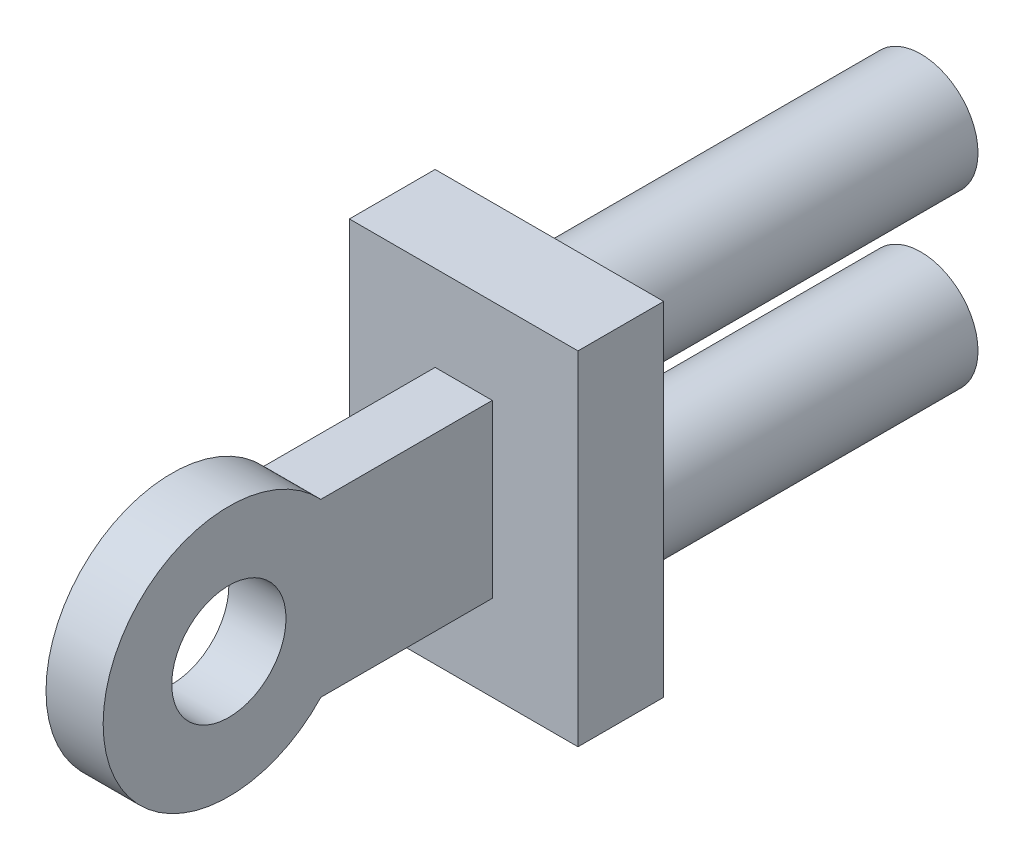
ISO-10303-21;
HEADER;
FILE_DESCRIPTION(('STEP AP214'),'2;1');
FILE_NAME('part.step','',(''),(''),'','','');
FILE_SCHEMA(('AUTOMOTIVE_DESIGN { 1 0 10303 214 1 1 1 1 }'));
ENDSEC;
DATA;
#1=APPLICATION_CONTEXT('core data for automotive mechanical design processes');
#2=APPLICATION_PROTOCOL_DEFINITION('international standard','automotive_design',2000,#1);
#3=PRODUCT_CONTEXT('',#1,'mechanical');
#4=PRODUCT('Part','Part','',(#3));
#5=PRODUCT_RELATED_PRODUCT_CATEGORY('part','',(#4));
#6=PRODUCT_DEFINITION_FORMATION('','',#4);
#7=PRODUCT_DEFINITION_CONTEXT('part definition',#1,'design');
#8=PRODUCT_DEFINITION('design','',#6,#7);
#9=PRODUCT_DEFINITION_SHAPE('','',#8);
#10=(LENGTH_UNIT() NAMED_UNIT(*) SI_UNIT(.MILLI.,.METRE.));
#11=(NAMED_UNIT(*) PLANE_ANGLE_UNIT() SI_UNIT($,.RADIAN.));
#12=(NAMED_UNIT(*) SI_UNIT($,.STERADIAN.) SOLID_ANGLE_UNIT());
#13=UNCERTAINTY_MEASURE_WITH_UNIT(LENGTH_MEASURE(1.E-05),#10,'distance_accuracy_value','');
#14=(GEOMETRIC_REPRESENTATION_CONTEXT(3) GLOBAL_UNCERTAINTY_ASSIGNED_CONTEXT((#13)) GLOBAL_UNIT_ASSIGNED_CONTEXT((#10,
#11,#12)) REPRESENTATION_CONTEXT('',''));
#15=CARTESIAN_POINT('',(0.,0.,0.));
#16=DIRECTION('',(0.,0.,1.));
#17=DIRECTION('',(1.,0.,0.));
#18=AXIS2_PLACEMENT_3D('',#15,#16,#17);
#19=CARTESIAN_POINT('',(-2.,3.,1.5));
#20=DIRECTION('',(1.,0.,0.));
#21=DIRECTION('',(0.,1.,0.));
#22=AXIS2_PLACEMENT_3D('',#19,#20,#21);
#23=PLANE('',#22);
#24=DIRECTION('',(0.,-1.,0.));
#25=VECTOR('',#24,1.);
#26=CARTESIAN_POINT('',(-2.,3.,0.));
#27=LINE('',#26,#25);
#28=CARTESIAN_POINT('',(-2.,3.,0.));
#29=VERTEX_POINT('',#28);
#30=CARTESIAN_POINT('',(-2.,-3.,0.));
#31=VERTEX_POINT('',#30);
#32=EDGE_CURVE('E136',#29,#31,#27,.T.);
#33=ORIENTED_EDGE('',*,*,#32,.T.);
#34=DIRECTION('',(0.,0.,-1.));
#35=VECTOR('',#34,1.);
#36=CARTESIAN_POINT('',(-2.,-3.,1.5));
#37=LINE('',#36,#35);
#38=CARTESIAN_POINT('',(-2.,-3.,1.5));
#39=VERTEX_POINT('',#38);
#40=EDGE_CURVE('E11',#39,#31,#37,.T.);
#41=ORIENTED_EDGE('',*,*,#40,.F.);
#42=DIRECTION('',(0.,-1.,0.));
#43=VECTOR('',#42,1.);
#44=CARTESIAN_POINT('',(-2.,3.,1.5));
#45=LINE('',#44,#43);
#46=CARTESIAN_POINT('',(-2.,3.,1.5));
#47=VERTEX_POINT('',#46);
#48=EDGE_CURVE('E137',#47,#39,#45,.T.);
#49=ORIENTED_EDGE('',*,*,#48,.F.);
#50=DIRECTION('',(0.,0.,-1.));
#51=VECTOR('',#50,1.);
#52=CARTESIAN_POINT('',(-2.,3.,1.5));
#53=LINE('',#52,#51);
#54=EDGE_CURVE('E147',#47,#29,#53,.T.);
#55=ORIENTED_EDGE('',*,*,#54,.T.);
#56=EDGE_LOOP('',(#33,#41,#49,#55));
#57=FACE_BOUND('',#56,.T.);
#58=ADVANCED_FACE('F32',(#57),#23,.F.);
#59=CARTESIAN_POINT('',(2.,-3.,1.5));
#60=DIRECTION('',(0.,1.,0.));
#61=DIRECTION('',(-1.,0.,0.));
#62=AXIS2_PLACEMENT_3D('',#59,#60,#61);
#63=PLANE('',#62);
#64=DIRECTION('',(1.,0.,0.));
#65=VECTOR('',#64,1.);
#66=CARTESIAN_POINT('',(2.,-3.,0.));
#67=LINE('',#66,#65);
#68=CARTESIAN_POINT('',(2.,-3.,0.));
#69=VERTEX_POINT('',#68);
#70=EDGE_CURVE('E150',#31,#69,#67,.T.);
#71=ORIENTED_EDGE('',*,*,#70,.T.);
#72=DIRECTION('',(0.,0.,-1.));
#73=VECTOR('',#72,1.);
#74=CARTESIAN_POINT('',(2.,-3.,1.5));
#75=LINE('',#74,#73);
#76=CARTESIAN_POINT('',(2.,-3.,1.5));
#77=VERTEX_POINT('',#76);
#78=EDGE_CURVE('E39',#77,#69,#75,.T.);
#79=ORIENTED_EDGE('',*,*,#78,.F.);
#80=DIRECTION('',(1.,0.,0.));
#81=VECTOR('',#80,1.);
#82=CARTESIAN_POINT('',(2.,-3.,1.5));
#83=LINE('',#82,#81);
#84=EDGE_CURVE('E140',#39,#77,#83,.T.);
#85=ORIENTED_EDGE('',*,*,#84,.F.);
#86=ORIENTED_EDGE('',*,*,#40,.T.);
#87=EDGE_LOOP('',(#71,#79,#85,#86));
#88=FACE_BOUND('',#87,.T.);
#89=ADVANCED_FACE('F180',(#88),#63,.F.);
#90=CARTESIAN_POINT('',(2.,3.,1.5));
#91=DIRECTION('',(-1.,0.,0.));
#92=DIRECTION('',(0.,-1.,0.));
#93=AXIS2_PLACEMENT_3D('',#90,#91,#92);
#94=PLANE('',#93);
#95=DIRECTION('',(0.,1.,0.));
#96=VECTOR('',#95,1.);
#97=CARTESIAN_POINT('',(2.,3.,0.));
#98=LINE('',#97,#96);
#99=CARTESIAN_POINT('',(2.,3.,0.));
#100=VERTEX_POINT('',#99);
#101=EDGE_CURVE('E152',#69,#100,#98,.T.);
#102=ORIENTED_EDGE('',*,*,#101,.T.);
#103=DIRECTION('',(0.,0.,-1.));
#104=VECTOR('',#103,1.);
#105=CARTESIAN_POINT('',(2.,3.,1.5));
#106=LINE('',#105,#104);
#107=CARTESIAN_POINT('',(2.,3.,1.5));
#108=VERTEX_POINT('',#107);
#109=EDGE_CURVE('E157',#108,#100,#106,.T.);
#110=ORIENTED_EDGE('',*,*,#109,.F.);
#111=DIRECTION('',(0.,1.,0.));
#112=VECTOR('',#111,1.);
#113=CARTESIAN_POINT('',(2.,3.,1.5));
#114=LINE('',#113,#112);
#115=EDGE_CURVE('E143',#77,#108,#114,.T.);
#116=ORIENTED_EDGE('',*,*,#115,.F.);
#117=ORIENTED_EDGE('',*,*,#78,.T.);
#118=EDGE_LOOP('',(#102,#110,#116,#117));
#119=FACE_BOUND('',#118,.T.);
#120=ADVANCED_FACE('F164',(#119),#94,.F.);
#121=CARTESIAN_POINT('',(2.,3.,1.5));
#122=DIRECTION('',(0.,-1.,0.));
#123=DIRECTION('',(1.,0.,0.));
#124=AXIS2_PLACEMENT_3D('',#121,#122,#123);
#125=PLANE('',#124);
#126=DIRECTION('',(-1.,0.,0.));
#127=VECTOR('',#126,1.);
#128=CARTESIAN_POINT('',(2.,3.,0.));
#129=LINE('',#128,#127);
#130=EDGE_CURVE('E141',#100,#29,#129,.T.);
#131=ORIENTED_EDGE('',*,*,#130,.T.);
#132=ORIENTED_EDGE('',*,*,#54,.F.);
#133=DIRECTION('',(-1.,0.,0.));
#134=VECTOR('',#133,1.);
#135=CARTESIAN_POINT('',(2.,3.,1.5));
#136=LINE('',#135,#134);
#137=EDGE_CURVE('E145',#108,#47,#136,.T.);
#138=ORIENTED_EDGE('',*,*,#137,.F.);
#139=ORIENTED_EDGE('',*,*,#109,.T.);
#140=EDGE_LOOP('',(#131,#132,#138,#139));
#141=FACE_BOUND('',#140,.T.);
#142=ADVANCED_FACE('F173',(#141),#125,.F.);
#143=CARTESIAN_POINT('',(0.,0.,1.5));
#144=DIRECTION('',(0.,0.,-1.));
#145=DIRECTION('',(-1.,0.,0.));
#146=AXIS2_PLACEMENT_3D('',#143,#144,#145);
#147=PLANE('',#146);
#148=DIRECTION('',(-1.,0.,0.));
#149=VECTOR('',#148,1.);
#150=CARTESIAN_POINT('',(0.5,1.49999999999442,1.50000000002137));
#151=LINE('',#150,#149);
#152=CARTESIAN_POINT('',(0.5,1.49999999999442,1.5));
#153=VERTEX_POINT('',#152);
#154=CARTESIAN_POINT('',(-0.5,1.49999999999442,1.5));
#155=VERTEX_POINT('',#154);
#156=EDGE_CURVE('E46',#153,#155,#151,.T.);
#157=ORIENTED_EDGE('',*,*,#156,.F.);
#158=DIRECTION('',(0.,1.,0.));
#159=VECTOR('',#158,1.);
#160=CARTESIAN_POINT('',(0.5,-291545.,1.50000000002137));
#161=LINE('',#160,#159);
#162=CARTESIAN_POINT('',(0.5,-1.49999999999442,1.5));
#163=VERTEX_POINT('',#162);
#164=EDGE_CURVE('E51',#163,#153,#161,.T.);
#165=ORIENTED_EDGE('',*,*,#164,.F.);
#166=DIRECTION('',(-1.,0.,0.));
#167=VECTOR('',#166,1.);
#168=CARTESIAN_POINT('',(0.5,-1.49999999999442,1.50000000002137));
#169=LINE('',#168,#167);
#170=CARTESIAN_POINT('',(-0.5,-1.49999999999442,1.50000000002137));
#171=VERTEX_POINT('',#170);
#172=EDGE_CURVE('E132',#163,#171,#169,.T.);
#173=ORIENTED_EDGE('',*,*,#172,.T.);
#174=DIRECTION('',(0.,1.,0.));
#175=VECTOR('',#174,1.);
#176=CARTESIAN_POINT('',(-0.5,-291545.,1.50000000002137));
#177=LINE('',#176,#175);
#178=EDGE_CURVE('E116',#171,#155,#177,.T.);
#179=ORIENTED_EDGE('',*,*,#178,.T.);
#180=EDGE_LOOP('',(#157,#165,#173,#179));
#181=FACE_BOUND('',#180,.T.);
#182=ORIENTED_EDGE('',*,*,#48,.T.);
#183=ORIENTED_EDGE('',*,*,#84,.T.);
#184=ORIENTED_EDGE('',*,*,#115,.T.);
#185=ORIENTED_EDGE('',*,*,#137,.T.);
#186=EDGE_LOOP('',(#182,#183,#184,#185));
#187=FACE_BOUND('',#186,.T.);
#188=ADVANCED_FACE('F179',(#181,#187),#147,.F.);
#189=CARTESIAN_POINT('',(0.,0.,0.));
#190=DIRECTION('',(0.,0.,-1.));
#191=DIRECTION('',(-1.,0.,0.));
#192=AXIS2_PLACEMENT_3D('',#189,#190,#191);
#193=PLANE('',#192);
#194=CARTESIAN_POINT('',(0.,-1.5,0.));
#195=DIRECTION('',(0.,0.,-1.));
#196=DIRECTION('',(-1.,0.,0.));
#197=AXIS2_PLACEMENT_3D('',#194,#195,#196);
#198=CIRCLE('',#197,1.);
#199=CARTESIAN_POINT('',(1.,-1.5,0.));
#200=VERTEX_POINT('',#199);
#201=EDGE_CURVE('E235',#200,#200,#198,.T.);
#202=ORIENTED_EDGE('',*,*,#201,.F.);
#203=EDGE_LOOP('',(#202));
#204=FACE_BOUND('',#203,.T.);
#205=CARTESIAN_POINT('',(0.,1.5,0.));
#206=DIRECTION('',(0.,0.,-1.));
#207=DIRECTION('',(-1.,0.,0.));
#208=AXIS2_PLACEMENT_3D('',#205,#206,#207);
#209=CIRCLE('',#208,1.);
#210=CARTESIAN_POINT('',(1.,1.5,0.));
#211=VERTEX_POINT('',#210);
#212=EDGE_CURVE('E234',#211,#211,#209,.T.);
#213=ORIENTED_EDGE('',*,*,#212,.F.);
#214=EDGE_LOOP('',(#213));
#215=FACE_BOUND('',#214,.T.);
#216=ORIENTED_EDGE('',*,*,#32,.F.);
#217=ORIENTED_EDGE('',*,*,#130,.F.);
#218=ORIENTED_EDGE('',*,*,#101,.F.);
#219=ORIENTED_EDGE('',*,*,#70,.F.);
#220=EDGE_LOOP('',(#216,#217,#218,#219));
#221=FACE_BOUND('',#220,.T.);
#222=ADVANCED_FACE('F170',(#204,#215,#221),#193,.T.);
#223=CARTESIAN_POINT('',(0.5,0.,6.10934769394311));
#224=DIRECTION('',(1.,0.,0.));
#225=DIRECTION('',(0.,0.,-1.));
#226=AXIS2_PLACEMENT_3D('',#223,#224,#225);
#227=PLANE('',#226);
#228=ORIENTED_EDGE('',*,*,#164,.T.);
#229=DIRECTION('',(0.,0.,1.));
#230=VECTOR('',#229,1.);
#231=CARTESIAN_POINT('',(0.5,1.49999999990769,400004.154673847));
#232=LINE('',#231,#230);
#233=CARTESIAN_POINT('',(0.5,1.50000000000064,4.5000000000006));
#234=VERTEX_POINT('',#233);
#235=EDGE_CURVE('E127',#153,#234,#232,.T.);
#236=ORIENTED_EDGE('',*,*,#235,.T.);
#237=CARTESIAN_POINT('',(0.5,0.,6.10934769394311));
#238=DIRECTION('',(1.,0.,0.));
#239=DIRECTION('',(0.,0.,-1.));
#240=AXIS2_PLACEMENT_3D('',#237,#238,#239);
#241=CIRCLE('',#240,2.2);
#242=CARTESIAN_POINT('',(0.5,-1.49999999999442,4.50000000000728));
#243=VERTEX_POINT('',#242);
#244=EDGE_CURVE('E102',#234,#243,#241,.T.);
#245=ORIENTED_EDGE('',*,*,#244,.T.);
#246=DIRECTION('',(0.,0.,-1.));
#247=VECTOR('',#246,1.);
#248=CARTESIAN_POINT('',(0.5,-1.49999999990769,400004.154673847));
#249=LINE('',#248,#247);
#250=EDGE_CURVE('E130',#243,#163,#249,.T.);
#251=ORIENTED_EDGE('',*,*,#250,.T.);
#252=EDGE_LOOP('',(#228,#236,#245,#251));
#253=FACE_BOUND('',#252,.T.);
#254=CARTESIAN_POINT('',(0.5,0.,6.10934769394311));
#255=DIRECTION('',(1.,0.,0.));
#256=DIRECTION('',(0.,0.,-1.));
#257=AXIS2_PLACEMENT_3D('',#254,#255,#256);
#258=CIRCLE('',#257,1.);
#259=CARTESIAN_POINT('',(0.5,0.,5.10934769394311));
#260=VERTEX_POINT('',#259);
#261=EDGE_CURVE('E123',#260,#260,#258,.T.);
#262=ORIENTED_EDGE('',*,*,#261,.F.);
#263=EDGE_LOOP('',(#262));
#264=FACE_BOUND('',#263,.T.);
#265=ADVANCED_FACE('F192',(#253,#264),#227,.T.);
#266=CARTESIAN_POINT('',(0.5,1.49999999990769,400004.154673847));
#267=DIRECTION('',(0.,-1.,0.));
#268=DIRECTION('',(0.,0.,-1.));
#269=AXIS2_PLACEMENT_3D('',#266,#267,#268);
#270=PLANE('',#269);
#271=ORIENTED_EDGE('',*,*,#156,.T.);
#272=DIRECTION('',(0.,0.,1.));
#273=VECTOR('',#272,1.);
#274=CARTESIAN_POINT('',(-0.5,1.49999999990769,400004.154673847));
#275=LINE('',#274,#273);
#276=CARTESIAN_POINT('',(-0.5,1.50000000000064,4.5000000000006));
#277=VERTEX_POINT('',#276);
#278=EDGE_CURVE('E111',#155,#277,#275,.T.);
#279=ORIENTED_EDGE('',*,*,#278,.T.);
#280=DIRECTION('',(-1.,0.,0.));
#281=VECTOR('',#280,1.);
#282=CARTESIAN_POINT('',(0.5,1.50000000000064,4.5000000000006));
#283=LINE('',#282,#281);
#284=EDGE_CURVE('E96',#234,#277,#283,.T.);
#285=ORIENTED_EDGE('',*,*,#284,.F.);
#286=ORIENTED_EDGE('',*,*,#235,.F.);
#287=EDGE_LOOP('',(#271,#279,#285,#286));
#288=FACE_BOUND('',#287,.T.);
#289=ADVANCED_FACE('F115',(#288),#270,.F.);
#290=CARTESIAN_POINT('',(0.5,0.,6.10934769394311));
#291=DIRECTION('',(-1.,0.,0.));
#292=DIRECTION('',(0.,-1.,0.));
#293=AXIS2_PLACEMENT_3D('',#290,#291,#292);
#294=CYLINDRICAL_SURFACE('',#293,2.2);
#295=ORIENTED_EDGE('',*,*,#284,.T.);
#296=CARTESIAN_POINT('',(-0.5,0.,6.10934769394311));
#297=DIRECTION('',(1.,0.,0.));
#298=DIRECTION('',(0.,0.,-1.));
#299=AXIS2_PLACEMENT_3D('',#296,#297,#298);
#300=CIRCLE('',#299,2.2);
#301=CARTESIAN_POINT('',(-0.5,-1.49999999999442,4.50000000000728));
#302=VERTEX_POINT('',#301);
#303=EDGE_CURVE('E100',#277,#302,#300,.T.);
#304=ORIENTED_EDGE('',*,*,#303,.T.);
#305=DIRECTION('',(-1.,0.,0.));
#306=VECTOR('',#305,1.);
#307=CARTESIAN_POINT('',(0.5,-1.49999999999442,4.50000000000728));
#308=LINE('',#307,#306);
#309=EDGE_CURVE('E105',#243,#302,#308,.T.);
#310=ORIENTED_EDGE('',*,*,#309,.F.);
#311=ORIENTED_EDGE('',*,*,#244,.F.);
#312=EDGE_LOOP('',(#295,#304,#310,#311));
#313=FACE_BOUND('',#312,.T.);
#314=ADVANCED_FACE('F98',(#313),#294,.T.);
#315=CARTESIAN_POINT('',(0.5,-1.49999999990769,400004.154673847));
#316=DIRECTION('',(0.,1.,0.));
#317=DIRECTION('',(0.,0.,1.));
#318=AXIS2_PLACEMENT_3D('',#315,#316,#317);
#319=PLANE('',#318);
#320=ORIENTED_EDGE('',*,*,#309,.T.);
#321=DIRECTION('',(0.,0.,-1.));
#322=VECTOR('',#321,1.);
#323=CARTESIAN_POINT('',(-0.5,-1.49999999990769,400004.154673847));
#324=LINE('',#323,#322);
#325=EDGE_CURVE('E113',#302,#171,#324,.T.);
#326=ORIENTED_EDGE('',*,*,#325,.T.);
#327=ORIENTED_EDGE('',*,*,#172,.F.);
#328=ORIENTED_EDGE('',*,*,#250,.F.);
#329=EDGE_LOOP('',(#320,#326,#327,#328));
#330=FACE_BOUND('',#329,.T.);
#331=ADVANCED_FACE('F200',(#330),#319,.F.);
#332=CARTESIAN_POINT('',(0.5,0.,6.10934769394311));
#333=DIRECTION('',(-1.,0.,0.));
#334=DIRECTION('',(0.,-1.,0.));
#335=AXIS2_PLACEMENT_3D('',#332,#333,#334);
#336=CYLINDRICAL_SURFACE('',#335,1.);
#337=ORIENTED_EDGE('',*,*,#261,.T.);
#338=EDGE_LOOP('',(#337));
#339=FACE_BOUND('',#338,.T.);
#340=CARTESIAN_POINT('',(-0.5,0.,6.10934769394311));
#341=DIRECTION('',(1.,0.,0.));
#342=DIRECTION('',(0.,0.,-1.));
#343=AXIS2_PLACEMENT_3D('',#340,#341,#342);
#344=CIRCLE('',#343,1.);
#345=CARTESIAN_POINT('',(-0.5,0.,5.10934769394311));
#346=VERTEX_POINT('',#345);
#347=EDGE_CURVE('E118',#346,#346,#344,.T.);
#348=ORIENTED_EDGE('',*,*,#347,.F.);
#349=EDGE_LOOP('',(#348));
#350=FACE_BOUND('',#349,.T.);
#351=ADVANCED_FACE('F203',(#339,#350),#336,.F.);
#352=CARTESIAN_POINT('',(-0.5,0.,6.10934769394311));
#353=DIRECTION('',(1.,0.,0.));
#354=DIRECTION('',(0.,0.,-1.));
#355=AXIS2_PLACEMENT_3D('',#352,#353,#354);
#356=PLANE('',#355);
#357=ORIENTED_EDGE('',*,*,#347,.T.);
#358=EDGE_LOOP('',(#357));
#359=FACE_BOUND('',#358,.T.);
#360=ORIENTED_EDGE('',*,*,#178,.F.);
#361=ORIENTED_EDGE('',*,*,#325,.F.);
#362=ORIENTED_EDGE('',*,*,#303,.F.);
#363=ORIENTED_EDGE('',*,*,#278,.F.);
#364=EDGE_LOOP('',(#360,#361,#362,#363));
#365=FACE_BOUND('',#364,.T.);
#366=ADVANCED_FACE('F110',(#359,#365),#356,.F.);
#367=CARTESIAN_POINT('',(0.,1.5,-6.5));
#368=DIRECTION('',(0.,0.,1.));
#369=DIRECTION('',(1.,0.,0.));
#370=AXIS2_PLACEMENT_3D('',#367,#368,#369);
#371=CYLINDRICAL_SURFACE('',#370,1.);
#372=CARTESIAN_POINT('',(0.,1.5,-6.5));
#373=DIRECTION('',(0.,0.,-1.));
#374=DIRECTION('',(-1.,0.,0.));
#375=AXIS2_PLACEMENT_3D('',#372,#373,#374);
#376=CIRCLE('',#375,1.);
#377=CARTESIAN_POINT('',(1.,1.5,-6.5));
#378=VERTEX_POINT('',#377);
#379=EDGE_CURVE('E238',#378,#378,#376,.T.);
#380=CARTESIAN_POINT('',(1.,1.5,-6.5));
#381=CARTESIAN_POINT('',(1.,1.5,-6.43229166666667));
#382=CARTESIAN_POINT('',(1.,1.5,-6.36458333333333));
#383=CARTESIAN_POINT('',(1.,1.5,-6.22916666666667));
#384=CARTESIAN_POINT('',(1.,1.5,-6.16145833333333));
#385=CARTESIAN_POINT('',(1.,1.5,-6.02604166666667));
#386=CARTESIAN_POINT('',(1.,1.5,-5.95833333333333));
#387=CARTESIAN_POINT('',(1.,1.5,-5.82291666666667));
#388=CARTESIAN_POINT('',(1.,1.5,-5.75520833333333));
#389=CARTESIAN_POINT('',(1.,1.5,-5.61979166666667));
#390=CARTESIAN_POINT('',(1.,1.5,-5.55208333333333));
#391=CARTESIAN_POINT('',(1.,1.5,-5.41666666666667));
#392=CARTESIAN_POINT('',(1.,1.5,-5.34895833333333));
#393=CARTESIAN_POINT('',(1.,1.5,-5.21354166666667));
#394=CARTESIAN_POINT('',(1.,1.5,-5.14583333333333));
#395=CARTESIAN_POINT('',(1.,1.5,-5.01041666666667));
#396=CARTESIAN_POINT('',(1.,1.5,-4.94270833333333));
#397=CARTESIAN_POINT('',(1.,1.5,-4.80729166666667));
#398=CARTESIAN_POINT('',(1.,1.5,-4.73958333333333));
#399=CARTESIAN_POINT('',(1.,1.5,-4.60416666666667));
#400=CARTESIAN_POINT('',(1.,1.5,-4.53645833333333));
#401=CARTESIAN_POINT('',(1.,1.5,-4.40104166666667));
#402=CARTESIAN_POINT('',(1.,1.5,-4.33333333333333));
#403=CARTESIAN_POINT('',(1.,1.5,-4.19791666666667));
#404=CARTESIAN_POINT('',(1.,1.5,-4.13020833333333));
#405=CARTESIAN_POINT('',(1.,1.5,-3.99479166666667));
#406=CARTESIAN_POINT('',(1.,1.5,-3.92708333333333));
#407=CARTESIAN_POINT('',(1.,1.5,-3.79166666666667));
#408=CARTESIAN_POINT('',(1.,1.5,-3.72395833333333));
#409=CARTESIAN_POINT('',(1.,1.5,-3.58854166666667));
#410=CARTESIAN_POINT('',(1.,1.5,-3.52083333333333));
#411=CARTESIAN_POINT('',(1.,1.5,-3.38541666666667));
#412=CARTESIAN_POINT('',(1.,1.5,-3.31770833333333));
#413=CARTESIAN_POINT('',(1.,1.5,-3.18229166666667));
#414=CARTESIAN_POINT('',(1.,1.5,-3.11458333333333));
#415=CARTESIAN_POINT('',(1.,1.5,-2.97916666666667));
#416=CARTESIAN_POINT('',(1.,1.5,-2.91145833333333));
#417=CARTESIAN_POINT('',(1.,1.5,-2.77604166666667));
#418=CARTESIAN_POINT('',(1.,1.5,-2.70833333333333));
#419=CARTESIAN_POINT('',(1.,1.5,-2.57291666666667));
#420=CARTESIAN_POINT('',(1.,1.5,-2.50520833333333));
#421=CARTESIAN_POINT('',(1.,1.5,-2.36979166666667));
#422=CARTESIAN_POINT('',(1.,1.5,-2.30208333333333));
#423=CARTESIAN_POINT('',(1.,1.5,-2.16666666666667));
#424=CARTESIAN_POINT('',(1.,1.5,-2.09895833333333));
#425=CARTESIAN_POINT('',(1.,1.5,-1.96354166666667));
#426=CARTESIAN_POINT('',(1.,1.5,-1.89583333333333));
#427=CARTESIAN_POINT('',(1.,1.5,-1.76041666666667));
#428=CARTESIAN_POINT('',(1.,1.5,-1.69270833333333));
#429=CARTESIAN_POINT('',(1.,1.5,-1.55729166666667));
#430=CARTESIAN_POINT('',(1.,1.5,-1.48958333333333));
#431=CARTESIAN_POINT('',(1.,1.5,-1.35416666666667));
#432=CARTESIAN_POINT('',(1.,1.5,-1.28645833333333));
#433=CARTESIAN_POINT('',(1.,1.5,-1.15104166666667));
#434=CARTESIAN_POINT('',(1.,1.5,-1.08333333333333));
#435=CARTESIAN_POINT('',(1.,1.5,-0.947916666666667));
#436=CARTESIAN_POINT('',(1.,1.5,-0.880208333333333));
#437=CARTESIAN_POINT('',(1.,1.5,-0.744791666666667));
#438=CARTESIAN_POINT('',(1.,1.5,-0.677083333333333));
#439=CARTESIAN_POINT('',(1.,1.5,-0.541666666666667));
#440=CARTESIAN_POINT('',(1.,1.5,-0.473958333333333));
#441=CARTESIAN_POINT('',(1.,1.5,-0.338541666666667));
#442=CARTESIAN_POINT('',(1.,1.5,-0.270833333333334));
#443=CARTESIAN_POINT('',(1.,1.5,-0.135416666666667));
#444=CARTESIAN_POINT('',(1.,1.5,-0.0677083333333334));
#445=CARTESIAN_POINT('',(1.,1.5,0.));
#446=B_SPLINE_CURVE_WITH_KNOTS('',3,(#380,#381,#382,#383,#384,#385,#386,#387,#388,#389,#390,
#391,#392,#393,#394,#395,#396,#397,#398,#399,#400,#401,#402,#403,#404,#405,#406,#407,#408,#409,
#410,#411,#412,#413,#414,#415,#416,#417,#418,#419,#420,#421,#422,#423,#424,#425,#426,#427,#428,
#429,#430,#431,#432,#433,#434,#435,#436,#437,#438,#439,#440,#441,#442,#443,#444,#445),
.UNSPECIFIED.,.F.,.F.,(4,2,2,2,2,2,2,2,2,2,2,2,2,2,2,2,2,2,2,2,2,2,2,2,2,2,2,2,2,2,2,2,4),(0.,
0.203125,0.40625,0.609375000000001,0.812500000000001,1.015625,1.21875,1.421875,1.625,1.828125,
2.03125,2.234375,2.4375,2.640625,2.84375,3.046875,3.25,3.453125,3.65625,3.859375,4.0625,
4.265625,4.46875,4.671875,4.875,5.078125,5.28125,5.484375,5.6875,5.890625,6.09375,6.296875,6.5),.UNSPECIFIED.);
#447=EDGE_CURVE('BSEAM213',#378,#211,#446,.T.);
#448=ORIENTED_EDGE('',*,*,#379,.F.);
#449=ORIENTED_EDGE('',*,*,#212,.T.);
#450=ORIENTED_EDGE('',*,*,#447,.T.);
#451=ORIENTED_EDGE('',*,*,#447,.F.);
#452=EDGE_LOOP('',(#448,#450,#449,#451));
#453=FACE_BOUND('',#452,.T.);
#454=ADVANCED_FACE('F213',(#453),#371,.T.);
#455=CARTESIAN_POINT('',(0.,1.5,-6.5));
#456=DIRECTION('',(0.,0.,-1.));
#457=DIRECTION('',(-1.,0.,0.));
#458=AXIS2_PLACEMENT_3D('',#455,#456,#457);
#459=PLANE('',#458);
#460=ORIENTED_EDGE('',*,*,#379,.T.);
#461=EDGE_LOOP('',(#460));
#462=FACE_BOUND('',#461,.T.);
#463=ADVANCED_FACE('F217',(#462),#459,.T.);
#464=CARTESIAN_POINT('',(0.,-1.5,-6.5));
#465=DIRECTION('',(0.,0.,1.));
#466=DIRECTION('',(1.,0.,0.));
#467=AXIS2_PLACEMENT_3D('',#464,#465,#466);
#468=CYLINDRICAL_SURFACE('',#467,1.);
#469=CARTESIAN_POINT('',(0.,-1.5,-6.5));
#470=DIRECTION('',(0.,0.,-1.));
#471=DIRECTION('',(-1.,0.,0.));
#472=AXIS2_PLACEMENT_3D('',#469,#470,#471);
#473=CIRCLE('',#472,1.);
#474=CARTESIAN_POINT('',(1.,-1.5,-6.5));
#475=VERTEX_POINT('',#474);
#476=EDGE_CURVE('E233',#475,#475,#473,.T.);
#477=CARTESIAN_POINT('',(1.,-1.5,-6.5));
#478=CARTESIAN_POINT('',(1.,-1.5,-6.43229166666667));
#479=CARTESIAN_POINT('',(1.,-1.5,-6.36458333333333));
#480=CARTESIAN_POINT('',(1.,-1.5,-6.22916666666667));
#481=CARTESIAN_POINT('',(1.,-1.5,-6.16145833333333));
#482=CARTESIAN_POINT('',(1.,-1.5,-6.02604166666667));
#483=CARTESIAN_POINT('',(1.,-1.5,-5.95833333333333));
#484=CARTESIAN_POINT('',(1.,-1.5,-5.82291666666667));
#485=CARTESIAN_POINT('',(1.,-1.5,-5.75520833333333));
#486=CARTESIAN_POINT('',(1.,-1.5,-5.61979166666667));
#487=CARTESIAN_POINT('',(1.,-1.5,-5.55208333333333));
#488=CARTESIAN_POINT('',(1.,-1.5,-5.41666666666667));
#489=CARTESIAN_POINT('',(1.,-1.5,-5.34895833333333));
#490=CARTESIAN_POINT('',(1.,-1.5,-5.21354166666667));
#491=CARTESIAN_POINT('',(1.,-1.5,-5.14583333333333));
#492=CARTESIAN_POINT('',(1.,-1.5,-5.01041666666667));
#493=CARTESIAN_POINT('',(1.,-1.5,-4.94270833333333));
#494=CARTESIAN_POINT('',(1.,-1.5,-4.80729166666667));
#495=CARTESIAN_POINT('',(1.,-1.5,-4.73958333333333));
#496=CARTESIAN_POINT('',(1.,-1.5,-4.60416666666667));
#497=CARTESIAN_POINT('',(1.,-1.5,-4.53645833333333));
#498=CARTESIAN_POINT('',(1.,-1.5,-4.40104166666667));
#499=CARTESIAN_POINT('',(1.,-1.5,-4.33333333333333));
#500=CARTESIAN_POINT('',(1.,-1.5,-4.19791666666667));
#501=CARTESIAN_POINT('',(1.,-1.5,-4.13020833333333));
#502=CARTESIAN_POINT('',(1.,-1.5,-3.99479166666667));
#503=CARTESIAN_POINT('',(1.,-1.5,-3.92708333333333));
#504=CARTESIAN_POINT('',(1.,-1.5,-3.79166666666667));
#505=CARTESIAN_POINT('',(1.,-1.5,-3.72395833333333));
#506=CARTESIAN_POINT('',(1.,-1.5,-3.58854166666667));
#507=CARTESIAN_POINT('',(1.,-1.5,-3.52083333333333));
#508=CARTESIAN_POINT('',(1.,-1.5,-3.38541666666667));
#509=CARTESIAN_POINT('',(1.,-1.5,-3.31770833333333));
#510=CARTESIAN_POINT('',(1.,-1.5,-3.18229166666667));
#511=CARTESIAN_POINT('',(1.,-1.5,-3.11458333333333));
#512=CARTESIAN_POINT('',(1.,-1.5,-2.97916666666667));
#513=CARTESIAN_POINT('',(1.,-1.5,-2.91145833333333));
#514=CARTESIAN_POINT('',(1.,-1.5,-2.77604166666667));
#515=CARTESIAN_POINT('',(1.,-1.5,-2.70833333333333));
#516=CARTESIAN_POINT('',(1.,-1.5,-2.57291666666667));
#517=CARTESIAN_POINT('',(1.,-1.5,-2.50520833333333));
#518=CARTESIAN_POINT('',(1.,-1.5,-2.36979166666667));
#519=CARTESIAN_POINT('',(1.,-1.5,-2.30208333333333));
#520=CARTESIAN_POINT('',(1.,-1.5,-2.16666666666667));
#521=CARTESIAN_POINT('',(1.,-1.5,-2.09895833333333));
#522=CARTESIAN_POINT('',(1.,-1.5,-1.96354166666667));
#523=CARTESIAN_POINT('',(1.,-1.5,-1.89583333333333));
#524=CARTESIAN_POINT('',(1.,-1.5,-1.76041666666667));
#525=CARTESIAN_POINT('',(1.,-1.5,-1.69270833333333));
#526=CARTESIAN_POINT('',(1.,-1.5,-1.55729166666667));
#527=CARTESIAN_POINT('',(1.,-1.5,-1.48958333333333));
#528=CARTESIAN_POINT('',(1.,-1.5,-1.35416666666667));
#529=CARTESIAN_POINT('',(1.,-1.5,-1.28645833333333));
#530=CARTESIAN_POINT('',(1.,-1.5,-1.15104166666667));
#531=CARTESIAN_POINT('',(1.,-1.5,-1.08333333333333));
#532=CARTESIAN_POINT('',(1.,-1.5,-0.947916666666667));
#533=CARTESIAN_POINT('',(1.,-1.5,-0.880208333333333));
#534=CARTESIAN_POINT('',(1.,-1.5,-0.744791666666667));
#535=CARTESIAN_POINT('',(1.,-1.5,-0.677083333333333));
#536=CARTESIAN_POINT('',(1.,-1.5,-0.541666666666667));
#537=CARTESIAN_POINT('',(1.,-1.5,-0.473958333333333));
#538=CARTESIAN_POINT('',(1.,-1.5,-0.338541666666667));
#539=CARTESIAN_POINT('',(1.,-1.5,-0.270833333333334));
#540=CARTESIAN_POINT('',(1.,-1.5,-0.135416666666667));
#541=CARTESIAN_POINT('',(1.,-1.5,-0.0677083333333334));
#542=CARTESIAN_POINT('',(1.,-1.5,0.));
#543=B_SPLINE_CURVE_WITH_KNOTS('',3,(#477,#478,#479,#480,#481,#482,#483,#484,#485,#486,#487,
#488,#489,#490,#491,#492,#493,#494,#495,#496,#497,#498,#499,#500,#501,#502,#503,#504,#505,#506,
#507,#508,#509,#510,#511,#512,#513,#514,#515,#516,#517,#518,#519,#520,#521,#522,#523,#524,#525,
#526,#527,#528,#529,#530,#531,#532,#533,#534,#535,#536,#537,#538,#539,#540,#541,#542),
.UNSPECIFIED.,.F.,.F.,(4,2,2,2,2,2,2,2,2,2,2,2,2,2,2,2,2,2,2,2,2,2,2,2,2,2,2,2,2,2,2,2,4),(0.,
0.203125,0.40625,0.609375000000001,0.812500000000001,1.015625,1.21875,1.421875,1.625,1.828125,
2.03125,2.234375,2.4375,2.640625,2.84375,3.046875,3.25,3.453125,3.65625,3.859375,4.0625,
4.265625,4.46875,4.671875,4.875,5.078125,5.28125,5.484375,5.6875,5.890625,6.09375,6.296875,6.5),.UNSPECIFIED.);
#544=EDGE_CURVE('BSEAM221',#475,#200,#543,.T.);
#545=ORIENTED_EDGE('',*,*,#476,.F.);
#546=ORIENTED_EDGE('',*,*,#201,.T.);
#547=ORIENTED_EDGE('',*,*,#544,.T.);
#548=ORIENTED_EDGE('',*,*,#544,.F.);
#549=EDGE_LOOP('',(#545,#547,#546,#548));
#550=FACE_BOUND('',#549,.T.);
#551=ADVANCED_FACE('F221',(#550),#468,.T.);
#552=CARTESIAN_POINT('',(0.,-1.5,-6.5));
#553=DIRECTION('',(0.,0.,-1.));
#554=DIRECTION('',(-1.,0.,0.));
#555=AXIS2_PLACEMENT_3D('',#552,#553,#554);
#556=PLANE('',#555);
#557=ORIENTED_EDGE('',*,*,#476,.T.);
#558=EDGE_LOOP('',(#557));
#559=FACE_BOUND('',#558,.T.);
#560=ADVANCED_FACE('F225',(#559),#556,.T.);
#561=CLOSED_SHELL('',(#58,#89,#120,#142,#188,#222,#265,#289,#314,#331,#351,#366,#454,#463,#551,#560));
#562=MANIFOLD_SOLID_BREP('B2',#561);
#563=ADVANCED_BREP_SHAPE_REPRESENTATION('',(#18,#562),#14);
#564=SHAPE_DEFINITION_REPRESENTATION(#9,#563);
ENDSEC;
END-ISO-10303-21;
